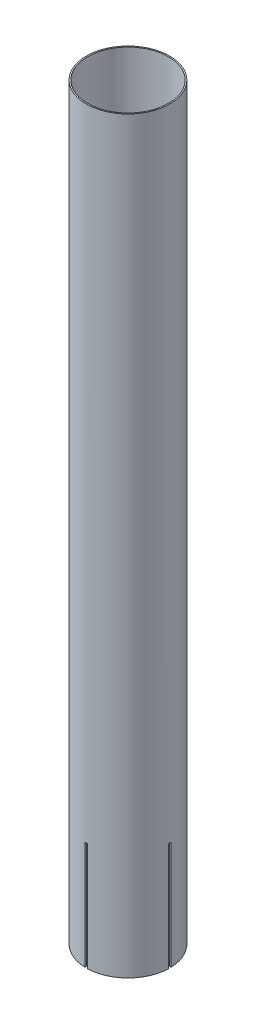
ISO-10303-21;
HEADER;
FILE_DESCRIPTION(('STEP AP214'),'2;1');
FILE_NAME('part.step','',(''),(''),'','','');
FILE_SCHEMA(('AUTOMOTIVE_DESIGN { 1 0 10303 214 1 1 1 1 }'));
ENDSEC;
DATA;
#1=APPLICATION_CONTEXT('core data for automotive mechanical design processes');
#2=APPLICATION_PROTOCOL_DEFINITION('international standard','automotive_design',2000,#1);
#3=PRODUCT_CONTEXT('',#1,'mechanical');
#4=PRODUCT('Part','Part','',(#3));
#5=PRODUCT_RELATED_PRODUCT_CATEGORY('part','',(#4));
#6=PRODUCT_DEFINITION_FORMATION('','',#4);
#7=PRODUCT_DEFINITION_CONTEXT('part definition',#1,'design');
#8=PRODUCT_DEFINITION('design','',#6,#7);
#9=PRODUCT_DEFINITION_SHAPE('','',#8);
#10=(LENGTH_UNIT() NAMED_UNIT(*) SI_UNIT(.MILLI.,.METRE.));
#11=(NAMED_UNIT(*) PLANE_ANGLE_UNIT() SI_UNIT($,.RADIAN.));
#12=(NAMED_UNIT(*) SI_UNIT($,.STERADIAN.) SOLID_ANGLE_UNIT());
#13=UNCERTAINTY_MEASURE_WITH_UNIT(LENGTH_MEASURE(1.E-05),#10,'distance_accuracy_value','');
#14=(GEOMETRIC_REPRESENTATION_CONTEXT(3) GLOBAL_UNCERTAINTY_ASSIGNED_CONTEXT((#13)) GLOBAL_UNIT_ASSIGNED_CONTEXT((#10,
#11,#12)) REPRESENTATION_CONTEXT('',''));
#15=CARTESIAN_POINT('',(0.,0.,0.));
#16=DIRECTION('',(0.,0.,1.));
#17=DIRECTION('',(1.,0.,0.));
#18=AXIS2_PLACEMENT_3D('',#15,#16,#17);
#19=CARTESIAN_POINT('',(0.,-725.,0.));
#20=DIRECTION('',(0.,1.,0.));
#21=DIRECTION('',(0.,0.,1.));
#22=AXIS2_PLACEMENT_3D('',#19,#20,#21);
#23=PLANE('',#22);
#24=CARTESIAN_POINT('',(0.,-725.,0.));
#25=DIRECTION('',(0.,1.,0.));
#26=DIRECTION('',(0.,0.,1.));
#27=AXIS2_PLACEMENT_3D('',#24,#25,#26);
#28=CIRCLE('',#27,78.35);
#29=CARTESIAN_POINT('',(-2.5,-725.,-78.3101047119719));
#30=VERTEX_POINT('',#29);
#31=CARTESIAN_POINT('',(-78.3101047119719,-725.,-2.50000000000027));
#32=VERTEX_POINT('',#31);
#33=EDGE_CURVE('E194',#30,#32,#28,.T.);
#34=ORIENTED_EDGE('',*,*,#33,.T.);
#35=DIRECTION('',(-1.,0.,0.));
#36=VECTOR('',#35,1.);
#37=CARTESIAN_POINT('',(80.7500000000003,-725.,-2.49999999999972));
#38=LINE('',#37,#36);
#39=CARTESIAN_POINT('',(-80.7112910316766,-725.,-2.50000000000028));
#40=VERTEX_POINT('',#39);
#41=EDGE_CURVE('E253',#32,#40,#38,.T.);
#42=ORIENTED_EDGE('',*,*,#41,.T.);
#43=CARTESIAN_POINT('',(0.,-725.,0.));
#44=DIRECTION('',(0.,1.,0.));
#45=DIRECTION('',(0.,0.,1.));
#46=AXIS2_PLACEMENT_3D('',#43,#44,#45);
#47=CIRCLE('',#46,80.75);
#48=CARTESIAN_POINT('',(-2.5,-725.,-80.7112910316766));
#49=VERTEX_POINT('',#48);
#50=EDGE_CURVE('E179',#49,#40,#47,.T.);
#51=ORIENTED_EDGE('',*,*,#50,.F.);
#52=DIRECTION('',(0.,0.,1.));
#53=VECTOR('',#52,1.);
#54=CARTESIAN_POINT('',(-2.5,-725.,-80.75));
#55=LINE('',#54,#53);
#56=EDGE_CURVE('E229',#49,#30,#55,.T.);
#57=ORIENTED_EDGE('',*,*,#56,.T.);
#58=EDGE_LOOP('',(#34,#42,#51,#57));
#59=FACE_BOUND('',#58,.T.);
#60=ADVANCED_FACE('F38',(#59),#23,.F.);
#61=CARTESIAN_POINT('',(80.7112910316766,-725.,-2.49999999999972));
#62=VERTEX_POINT('',#61);
#63=CARTESIAN_POINT('',(2.5,-725.,-80.7112910316766));
#64=VERTEX_POINT('',#63);
#65=EDGE_CURVE('E177',#62,#64,#47,.T.);
#66=ORIENTED_EDGE('',*,*,#65,.F.);
#67=CARTESIAN_POINT('',(78.3101047119719,-725.,-2.49999999999973));
#68=VERTEX_POINT('',#67);
#69=EDGE_CURVE('E251',#62,#68,#38,.T.);
#70=ORIENTED_EDGE('',*,*,#69,.T.);
#71=CARTESIAN_POINT('',(2.5,-725.,-78.3101047119719));
#72=VERTEX_POINT('',#71);
#73=EDGE_CURVE('E193',#68,#72,#28,.T.);
#74=ORIENTED_EDGE('',*,*,#73,.T.);
#75=DIRECTION('',(0.,0.,1.));
#76=VECTOR('',#75,1.);
#77=CARTESIAN_POINT('',(2.5,-725.,-80.75));
#78=LINE('',#77,#76);
#79=EDGE_CURVE('E232',#64,#72,#78,.T.);
#80=ORIENTED_EDGE('',*,*,#79,.F.);
#81=EDGE_LOOP('',(#66,#70,#74,#80));
#82=FACE_BOUND('',#81,.T.);
#83=ADVANCED_FACE('F274',(#82),#23,.F.);
#84=CARTESIAN_POINT('',(-80.7112910316766,-725.,2.49999999999972));
#85=VERTEX_POINT('',#84);
#86=CARTESIAN_POINT('',(-2.5,-725.,80.7112910316766));
#87=VERTEX_POINT('',#86);
#88=EDGE_CURVE('E183',#85,#87,#47,.T.);
#89=ORIENTED_EDGE('',*,*,#88,.F.);
#90=DIRECTION('',(-1.,0.,0.));
#91=VECTOR('',#90,1.);
#92=CARTESIAN_POINT('',(80.7500000000003,-725.,2.50000000000028));
#93=LINE('',#92,#91);
#94=CARTESIAN_POINT('',(-78.3101047119719,-725.,2.49999999999973));
#95=VERTEX_POINT('',#94);
#96=EDGE_CURVE('E169',#95,#85,#93,.T.);
#97=ORIENTED_EDGE('',*,*,#96,.F.);
#98=CARTESIAN_POINT('',(-2.5,-725.,78.3101047119719));
#99=VERTEX_POINT('',#98);
#100=EDGE_CURVE('E195',#95,#99,#28,.T.);
#101=ORIENTED_EDGE('',*,*,#100,.T.);
#102=EDGE_CURVE('E227',#99,#87,#55,.T.);
#103=ORIENTED_EDGE('',*,*,#102,.T.);
#104=EDGE_LOOP('',(#89,#97,#101,#103));
#105=FACE_BOUND('',#104,.T.);
#106=ADVANCED_FACE('F328',(#105),#23,.F.);
#107=CARTESIAN_POINT('',(0.,-725.,0.));
#108=DIRECTION('',(0.,1.,0.));
#109=DIRECTION('',(0.,0.,1.));
#110=AXIS2_PLACEMENT_3D('',#107,#108,#109);
#111=CYLINDRICAL_SURFACE('',#110,80.75);
#112=DIRECTION('',(0.,1.,0.));
#113=VECTOR('',#112,1.);
#114=CARTESIAN_POINT('',(80.7112910316766,-725.,-2.49999999999972));
#115=LINE('',#114,#113);
#116=CARTESIAN_POINT('',(80.7112910316766,-515.,-2.49999999999972));
#117=VERTEX_POINT('',#116);
#118=EDGE_CURVE('E158',#62,#117,#115,.T.);
#119=ORIENTED_EDGE('',*,*,#118,.F.);
#120=ORIENTED_EDGE('',*,*,#65,.T.);
#121=DIRECTION('',(0.,1.,0.));
#122=VECTOR('',#121,1.);
#123=CARTESIAN_POINT('',(2.5,-725.,-80.7112910316766));
#124=LINE('',#123,#122);
#125=CARTESIAN_POINT('',(2.5,-515.,-80.7112910316766));
#126=VERTEX_POINT('',#125);
#127=EDGE_CURVE('E222',#126,#64,#124,.F.);
#128=ORIENTED_EDGE('',*,*,#127,.F.);
#129=CARTESIAN_POINT('',(0.,-515.,0.));
#130=DIRECTION('',(0.,1.,0.));
#131=DIRECTION('',(0.,0.,1.));
#132=AXIS2_PLACEMENT_3D('',#129,#130,#131);
#133=CIRCLE('',#132,80.75);
#134=CARTESIAN_POINT('',(-2.5,-515.,-80.7112910316766));
#135=VERTEX_POINT('',#134);
#136=EDGE_CURVE('E219',#135,#126,#133,.F.);
#137=ORIENTED_EDGE('',*,*,#136,.F.);
#138=DIRECTION('',(0.,1.,0.));
#139=VECTOR('',#138,1.);
#140=CARTESIAN_POINT('',(-2.5,-725.,-80.7112910316766));
#141=LINE('',#140,#139);
#142=EDGE_CURVE('E217',#49,#135,#141,.T.);
#143=ORIENTED_EDGE('',*,*,#142,.F.);
#144=ORIENTED_EDGE('',*,*,#50,.T.);
#145=DIRECTION('',(0.,1.,0.));
#146=VECTOR('',#145,1.);
#147=CARTESIAN_POINT('',(-80.7112910316766,-725.,-2.50000000000028));
#148=LINE('',#147,#146);
#149=CARTESIAN_POINT('',(-80.7112910316766,-515.,-2.50000000000028));
#150=VERTEX_POINT('',#149);
#151=EDGE_CURVE('E159',#150,#40,#148,.F.);
#152=ORIENTED_EDGE('',*,*,#151,.F.);
#153=CARTESIAN_POINT('',(0.,-515.,0.));
#154=DIRECTION('',(0.,1.,0.));
#155=DIRECTION('',(0.,0.,1.));
#156=AXIS2_PLACEMENT_3D('',#153,#154,#155);
#157=CIRCLE('',#156,80.75);
#158=CARTESIAN_POINT('',(-80.7112910316766,-515.,2.49999999999972));
#159=VERTEX_POINT('',#158);
#160=EDGE_CURVE('E244',#159,#150,#157,.F.);
#161=ORIENTED_EDGE('',*,*,#160,.F.);
#162=DIRECTION('',(0.,1.,0.));
#163=VECTOR('',#162,1.);
#164=CARTESIAN_POINT('',(-80.7112910316766,-725.,2.49999999999972));
#165=LINE('',#164,#163);
#166=EDGE_CURVE('E242',#85,#159,#165,.T.);
#167=ORIENTED_EDGE('',*,*,#166,.F.);
#168=ORIENTED_EDGE('',*,*,#88,.T.);
#169=DIRECTION('',(0.,1.,0.));
#170=VECTOR('',#169,1.);
#171=CARTESIAN_POINT('',(-2.5,-725.,80.7112910316766));
#172=LINE('',#171,#170);
#173=CARTESIAN_POINT('',(-2.5,-515.,80.7112910316766));
#174=VERTEX_POINT('',#173);
#175=EDGE_CURVE('E213',#174,#87,#172,.F.);
#176=ORIENTED_EDGE('',*,*,#175,.F.);
#177=CARTESIAN_POINT('',(2.5,-515.,80.7112910316766));
#178=VERTEX_POINT('',#177);
#179=EDGE_CURVE('E221',#178,#174,#133,.F.);
#180=ORIENTED_EDGE('',*,*,#179,.F.);
#181=DIRECTION('',(0.,1.,0.));
#182=VECTOR('',#181,1.);
#183=CARTESIAN_POINT('',(2.5,-725.,80.7112910316766));
#184=LINE('',#183,#182);
#185=CARTESIAN_POINT('',(2.5,-725.,80.7112910316766));
#186=VERTEX_POINT('',#185);
#187=EDGE_CURVE('E175',#186,#178,#184,.T.);
#188=ORIENTED_EDGE('',*,*,#187,.F.);
#189=CARTESIAN_POINT('',(80.7112910316766,-725.,2.50000000000028));
#190=VERTEX_POINT('',#189);
#191=EDGE_CURVE('E166',#186,#190,#47,.T.);
#192=ORIENTED_EDGE('',*,*,#191,.T.);
#193=DIRECTION('',(0.,1.,0.));
#194=VECTOR('',#193,1.);
#195=CARTESIAN_POINT('',(80.7112910316766,-725.,2.50000000000028));
#196=LINE('',#195,#194);
#197=CARTESIAN_POINT('',(80.7112910316766,-515.,2.50000000000028));
#198=VERTEX_POINT('',#197);
#199=EDGE_CURVE('E150',#198,#190,#196,.F.);
#200=ORIENTED_EDGE('',*,*,#199,.F.);
#201=EDGE_CURVE('E246',#117,#198,#157,.F.);
#202=ORIENTED_EDGE('',*,*,#201,.F.);
#203=EDGE_LOOP('',(#119,#120,#128,#137,#143,#144,#152,#161,#167,#168,#176,#180,#188,#192,#200,#202));
#204=FACE_BOUND('',#203,.T.);
#205=CARTESIAN_POINT('',(0.,725.,0.));
#206=DIRECTION('',(0.,1.,0.));
#207=DIRECTION('',(0.,0.,1.));
#208=AXIS2_PLACEMENT_3D('',#205,#206,#207);
#209=CIRCLE('',#208,80.75);
#210=CARTESIAN_POINT('',(0.,725.,80.75));
#211=VERTEX_POINT('',#210);
#212=EDGE_CURVE('E202',#211,#211,#209,.T.);
#213=ORIENTED_EDGE('',*,*,#212,.F.);
#214=EDGE_LOOP('',(#213));
#215=FACE_BOUND('',#214,.T.);
#216=ADVANCED_FACE('F40',(#204,#215),#111,.T.);
#217=CARTESIAN_POINT('',(2.5,-725.,78.3101047119719));
#218=VERTEX_POINT('',#217);
#219=CARTESIAN_POINT('',(78.3101047119719,-725.,2.50000000000027));
#220=VERTEX_POINT('',#219);
#221=EDGE_CURVE('E168',#218,#220,#28,.T.);
#222=ORIENTED_EDGE('',*,*,#221,.T.);
#223=EDGE_CURVE('E153',#190,#220,#93,.T.);
#224=ORIENTED_EDGE('',*,*,#223,.F.);
#225=ORIENTED_EDGE('',*,*,#191,.F.);
#226=EDGE_CURVE('E230',#218,#186,#78,.T.);
#227=ORIENTED_EDGE('',*,*,#226,.F.);
#228=EDGE_LOOP('',(#222,#224,#225,#227));
#229=FACE_BOUND('',#228,.T.);
#230=ADVANCED_FACE('F164',(#229),#23,.F.);
#231=CARTESIAN_POINT('',(0.,-725.,0.));
#232=DIRECTION('',(0.,1.,0.));
#233=DIRECTION('',(0.,0.,1.));
#234=AXIS2_PLACEMENT_3D('',#231,#232,#233);
#235=CYLINDRICAL_SURFACE('',#234,78.35);
#236=ORIENTED_EDGE('',*,*,#73,.F.);
#237=DIRECTION('',(0.,1.,0.));
#238=VECTOR('',#237,1.);
#239=CARTESIAN_POINT('',(78.3101047119719,-725.,-2.49999999999973));
#240=LINE('',#239,#238);
#241=CARTESIAN_POINT('',(78.3101047119719,-515.,-2.49999999999973));
#242=VERTEX_POINT('',#241);
#243=EDGE_CURVE('E11',#68,#242,#240,.T.);
#244=ORIENTED_EDGE('',*,*,#243,.T.);
#245=CARTESIAN_POINT('',(0.,-515.,0.));
#246=DIRECTION('',(0.,1.,0.));
#247=DIRECTION('',(0.,0.,1.));
#248=AXIS2_PLACEMENT_3D('',#245,#246,#247);
#249=CIRCLE('',#248,78.35);
#250=CARTESIAN_POINT('',(78.3101047119719,-515.,2.50000000000027));
#251=VERTEX_POINT('',#250);
#252=EDGE_CURVE('E250',#242,#251,#249,.F.);
#253=ORIENTED_EDGE('',*,*,#252,.T.);
#254=DIRECTION('',(0.,1.,0.));
#255=VECTOR('',#254,1.);
#256=CARTESIAN_POINT('',(78.3101047119719,-725.,2.50000000000027));
#257=LINE('',#256,#255);
#258=EDGE_CURVE('E46',#251,#220,#257,.F.);
#259=ORIENTED_EDGE('',*,*,#258,.T.);
#260=ORIENTED_EDGE('',*,*,#221,.F.);
#261=DIRECTION('',(0.,1.,0.));
#262=VECTOR('',#261,1.);
#263=CARTESIAN_POINT('',(2.5,-725.,78.3101047119719));
#264=LINE('',#263,#262);
#265=CARTESIAN_POINT('',(2.5,-515.,78.3101047119719));
#266=VERTEX_POINT('',#265);
#267=EDGE_CURVE('E176',#218,#266,#264,.T.);
#268=ORIENTED_EDGE('',*,*,#267,.T.);
#269=CARTESIAN_POINT('',(0.,-515.,0.));
#270=DIRECTION('',(0.,1.,0.));
#271=DIRECTION('',(0.,0.,1.));
#272=AXIS2_PLACEMENT_3D('',#269,#270,#271);
#273=CIRCLE('',#272,78.35);
#274=CARTESIAN_POINT('',(-2.5,-515.,78.3101047119719));
#275=VERTEX_POINT('',#274);
#276=EDGE_CURVE('E181',#266,#275,#273,.F.);
#277=ORIENTED_EDGE('',*,*,#276,.T.);
#278=DIRECTION('',(0.,1.,0.));
#279=VECTOR('',#278,1.);
#280=CARTESIAN_POINT('',(-2.5,-725.,78.3101047119719));
#281=LINE('',#280,#279);
#282=EDGE_CURVE('E285',#275,#99,#281,.F.);
#283=ORIENTED_EDGE('',*,*,#282,.T.);
#284=ORIENTED_EDGE('',*,*,#100,.F.);
#285=DIRECTION('',(0.,1.,0.));
#286=VECTOR('',#285,1.);
#287=CARTESIAN_POINT('',(-78.3101047119719,-725.,2.49999999999973));
#288=LINE('',#287,#286);
#289=CARTESIAN_POINT('',(-78.3101047119719,-515.,2.49999999999973));
#290=VERTEX_POINT('',#289);
#291=EDGE_CURVE('E293',#95,#290,#288,.T.);
#292=ORIENTED_EDGE('',*,*,#291,.T.);
#293=CARTESIAN_POINT('',(-78.3101047119719,-515.,-2.50000000000027));
#294=VERTEX_POINT('',#293);
#295=EDGE_CURVE('E247',#290,#294,#249,.F.);
#296=ORIENTED_EDGE('',*,*,#295,.T.);
#297=DIRECTION('',(0.,1.,0.));
#298=VECTOR('',#297,1.);
#299=CARTESIAN_POINT('',(-78.3101047119719,-725.,-2.50000000000027));
#300=LINE('',#299,#298);
#301=EDGE_CURVE('E296',#294,#32,#300,.F.);
#302=ORIENTED_EDGE('',*,*,#301,.T.);
#303=ORIENTED_EDGE('',*,*,#33,.F.);
#304=DIRECTION('',(0.,1.,0.));
#305=VECTOR('',#304,1.);
#306=CARTESIAN_POINT('',(-2.5,-725.,-78.3101047119719));
#307=LINE('',#306,#305);
#308=CARTESIAN_POINT('',(-2.5,-515.,-78.3101047119719));
#309=VERTEX_POINT('',#308);
#310=EDGE_CURVE('E287',#30,#309,#307,.T.);
#311=ORIENTED_EDGE('',*,*,#310,.T.);
#312=CARTESIAN_POINT('',(2.5,-515.,-78.3101047119719));
#313=VERTEX_POINT('',#312);
#314=EDGE_CURVE('E284',#309,#313,#273,.F.);
#315=ORIENTED_EDGE('',*,*,#314,.T.);
#316=DIRECTION('',(0.,1.,0.));
#317=VECTOR('',#316,1.);
#318=CARTESIAN_POINT('',(2.5,-725.,-78.3101047119719));
#319=LINE('',#318,#317);
#320=EDGE_CURVE('E280',#313,#72,#319,.F.);
#321=ORIENTED_EDGE('',*,*,#320,.T.);
#322=EDGE_LOOP('',(#236,#244,#253,#259,#260,#268,#277,#283,#284,#292,#296,#302,#303,#311,#315,#321));
#323=FACE_BOUND('',#322,.T.);
#324=CARTESIAN_POINT('',(0.,725.,0.));
#325=DIRECTION('',(0.,1.,0.));
#326=DIRECTION('',(0.,0.,1.));
#327=AXIS2_PLACEMENT_3D('',#324,#325,#326);
#328=CIRCLE('',#327,78.35);
#329=CARTESIAN_POINT('',(0.,725.,78.35));
#330=VERTEX_POINT('',#329);
#331=EDGE_CURVE('E209',#330,#330,#328,.T.);
#332=ORIENTED_EDGE('',*,*,#331,.T.);
#333=EDGE_LOOP('',(#332));
#334=FACE_BOUND('',#333,.T.);
#335=ADVANCED_FACE('F267',(#323,#334),#235,.F.);
#336=CARTESIAN_POINT('',(0.,725.,0.));
#337=DIRECTION('',(0.,1.,0.));
#338=DIRECTION('',(0.,0.,1.));
#339=AXIS2_PLACEMENT_3D('',#336,#337,#338);
#340=PLANE('',#339);
#341=ORIENTED_EDGE('',*,*,#212,.T.);
#342=EDGE_LOOP('',(#341));
#343=FACE_BOUND('',#342,.T.);
#344=ORIENTED_EDGE('',*,*,#331,.F.);
#345=EDGE_LOOP('',(#344));
#346=FACE_BOUND('',#345,.T.);
#347=ADVANCED_FACE('F335',(#343,#346),#340,.T.);
#348=CARTESIAN_POINT('',(2.5,-725.,-80.75));
#349=DIRECTION('',(1.,0.,0.));
#350=DIRECTION('',(0.,0.,-1.));
#351=AXIS2_PLACEMENT_3D('',#348,#349,#350);
#352=PLANE('',#351);
#353=ORIENTED_EDGE('',*,*,#187,.T.);
#354=DIRECTION('',(0.,0.,1.));
#355=VECTOR('',#354,1.);
#356=CARTESIAN_POINT('',(2.5,-515.,-80.75));
#357=LINE('',#356,#355);
#358=EDGE_CURVE('E233',#266,#178,#357,.T.);
#359=ORIENTED_EDGE('',*,*,#358,.F.);
#360=ORIENTED_EDGE('',*,*,#267,.F.);
#361=ORIENTED_EDGE('',*,*,#226,.T.);
#362=EDGE_LOOP('',(#353,#359,#360,#361));
#363=FACE_BOUND('',#362,.T.);
#364=ADVANCED_FACE('F318',(#363),#352,.F.);
#365=CARTESIAN_POINT('',(-2.5,-515.,-80.75));
#366=DIRECTION('',(0.,1.,0.));
#367=DIRECTION('',(0.,0.,1.));
#368=AXIS2_PLACEMENT_3D('',#365,#366,#367);
#369=PLANE('',#368);
#370=ORIENTED_EDGE('',*,*,#179,.T.);
#371=DIRECTION('',(0.,0.,1.));
#372=VECTOR('',#371,1.);
#373=CARTESIAN_POINT('',(-2.5,-515.,-80.75));
#374=LINE('',#373,#372);
#375=EDGE_CURVE('E237',#275,#174,#374,.T.);
#376=ORIENTED_EDGE('',*,*,#375,.F.);
#377=ORIENTED_EDGE('',*,*,#276,.F.);
#378=ORIENTED_EDGE('',*,*,#358,.T.);
#379=EDGE_LOOP('',(#370,#376,#377,#378));
#380=FACE_BOUND('',#379,.T.);
#381=ADVANCED_FACE('F311',(#380),#369,.F.);
#382=CARTESIAN_POINT('',(-2.5,-725.,-80.75));
#383=DIRECTION('',(-1.,0.,0.));
#384=DIRECTION('',(0.,0.,1.));
#385=AXIS2_PLACEMENT_3D('',#382,#383,#384);
#386=PLANE('',#385);
#387=ORIENTED_EDGE('',*,*,#175,.T.);
#388=ORIENTED_EDGE('',*,*,#102,.F.);
#389=ORIENTED_EDGE('',*,*,#282,.F.);
#390=ORIENTED_EDGE('',*,*,#375,.T.);
#391=EDGE_LOOP('',(#387,#388,#389,#390));
#392=FACE_BOUND('',#391,.T.);
#393=ADVANCED_FACE('F319',(#392),#386,.F.);
#394=ORIENTED_EDGE('',*,*,#142,.T.);
#395=EDGE_CURVE('E226',#135,#309,#374,.T.);
#396=ORIENTED_EDGE('',*,*,#395,.T.);
#397=ORIENTED_EDGE('',*,*,#310,.F.);
#398=ORIENTED_EDGE('',*,*,#56,.F.);
#399=EDGE_LOOP('',(#394,#396,#397,#398));
#400=FACE_BOUND('',#399,.T.);
#401=ADVANCED_FACE('F303',(#400),#386,.F.);
#402=ORIENTED_EDGE('',*,*,#136,.T.);
#403=EDGE_CURVE('E236',#126,#313,#357,.T.);
#404=ORIENTED_EDGE('',*,*,#403,.T.);
#405=ORIENTED_EDGE('',*,*,#314,.F.);
#406=ORIENTED_EDGE('',*,*,#395,.F.);
#407=EDGE_LOOP('',(#402,#404,#405,#406));
#408=FACE_BOUND('',#407,.T.);
#409=ADVANCED_FACE('F308',(#408),#369,.F.);
#410=ORIENTED_EDGE('',*,*,#127,.T.);
#411=ORIENTED_EDGE('',*,*,#79,.T.);
#412=ORIENTED_EDGE('',*,*,#320,.F.);
#413=ORIENTED_EDGE('',*,*,#403,.F.);
#414=EDGE_LOOP('',(#410,#411,#412,#413));
#415=FACE_BOUND('',#414,.T.);
#416=ADVANCED_FACE('F278',(#415),#352,.F.);
#417=CARTESIAN_POINT('',(80.7500000000003,-725.,2.50000000000028));
#418=DIRECTION('',(0.,0.,1.));
#419=DIRECTION('',(1.,0.,0.));
#420=AXIS2_PLACEMENT_3D('',#417,#418,#419);
#421=PLANE('',#420);
#422=ORIENTED_EDGE('',*,*,#166,.T.);
#423=DIRECTION('',(-1.,0.,0.));
#424=VECTOR('',#423,1.);
#425=CARTESIAN_POINT('',(80.7500000000003,-515.,2.50000000000028));
#426=LINE('',#425,#424);
#427=EDGE_CURVE('E61',#290,#159,#426,.T.);
#428=ORIENTED_EDGE('',*,*,#427,.F.);
#429=ORIENTED_EDGE('',*,*,#291,.F.);
#430=ORIENTED_EDGE('',*,*,#96,.T.);
#431=EDGE_LOOP('',(#422,#428,#429,#430));
#432=FACE_BOUND('',#431,.T.);
#433=ADVANCED_FACE('F316',(#432),#421,.F.);
#434=CARTESIAN_POINT('',(80.7500000000003,-515.,-2.49999999999972));
#435=DIRECTION('',(0.,1.,0.));
#436=DIRECTION('',(0.,0.,1.));
#437=AXIS2_PLACEMENT_3D('',#434,#435,#436);
#438=PLANE('',#437);
#439=ORIENTED_EDGE('',*,*,#160,.T.);
#440=DIRECTION('',(-1.,0.,0.));
#441=VECTOR('',#440,1.);
#442=CARTESIAN_POINT('',(80.7500000000003,-515.,-2.49999999999972));
#443=LINE('',#442,#441);
#444=EDGE_CURVE('E256',#294,#150,#443,.T.);
#445=ORIENTED_EDGE('',*,*,#444,.F.);
#446=ORIENTED_EDGE('',*,*,#295,.F.);
#447=ORIENTED_EDGE('',*,*,#427,.T.);
#448=EDGE_LOOP('',(#439,#445,#446,#447));
#449=FACE_BOUND('',#448,.T.);
#450=ADVANCED_FACE('F300',(#449),#438,.F.);
#451=CARTESIAN_POINT('',(80.7500000000003,-725.,-2.49999999999972));
#452=DIRECTION('',(0.,0.,-1.));
#453=DIRECTION('',(-1.,0.,0.));
#454=AXIS2_PLACEMENT_3D('',#451,#452,#453);
#455=PLANE('',#454);
#456=ORIENTED_EDGE('',*,*,#151,.T.);
#457=ORIENTED_EDGE('',*,*,#41,.F.);
#458=ORIENTED_EDGE('',*,*,#301,.F.);
#459=ORIENTED_EDGE('',*,*,#444,.T.);
#460=EDGE_LOOP('',(#456,#457,#458,#459));
#461=FACE_BOUND('',#460,.T.);
#462=ADVANCED_FACE('F298',(#461),#455,.F.);
#463=ORIENTED_EDGE('',*,*,#118,.T.);
#464=EDGE_CURVE('E258',#117,#242,#443,.T.);
#465=ORIENTED_EDGE('',*,*,#464,.T.);
#466=ORIENTED_EDGE('',*,*,#243,.F.);
#467=ORIENTED_EDGE('',*,*,#69,.F.);
#468=EDGE_LOOP('',(#463,#465,#466,#467));
#469=FACE_BOUND('',#468,.T.);
#470=ADVANCED_FACE('F431',(#469),#455,.F.);
#471=ORIENTED_EDGE('',*,*,#199,.T.);
#472=ORIENTED_EDGE('',*,*,#223,.T.);
#473=ORIENTED_EDGE('',*,*,#258,.F.);
#474=EDGE_CURVE('E53',#198,#251,#426,.T.);
#475=ORIENTED_EDGE('',*,*,#474,.F.);
#476=EDGE_LOOP('',(#471,#472,#473,#475));
#477=FACE_BOUND('',#476,.T.);
#478=ADVANCED_FACE('F152',(#477),#421,.F.);
#479=ORIENTED_EDGE('',*,*,#201,.T.);
#480=ORIENTED_EDGE('',*,*,#474,.T.);
#481=ORIENTED_EDGE('',*,*,#252,.F.);
#482=ORIENTED_EDGE('',*,*,#464,.F.);
#483=EDGE_LOOP('',(#479,#480,#481,#482));
#484=FACE_BOUND('',#483,.T.);
#485=ADVANCED_FACE('F269',(#484),#438,.F.);
#486=CLOSED_SHELL('',(#60,#83,#106,#216,#230,#335,#347,#364,#381,#393,#401,#409,#416,#433,#450,
#462,#470,#478,#485));
#487=MANIFOLD_SOLID_BREP('B2',#486);
#488=ADVANCED_BREP_SHAPE_REPRESENTATION('',(#18,#487),#14);
#489=SHAPE_DEFINITION_REPRESENTATION(#9,#488);
ENDSEC;
END-ISO-10303-21;
